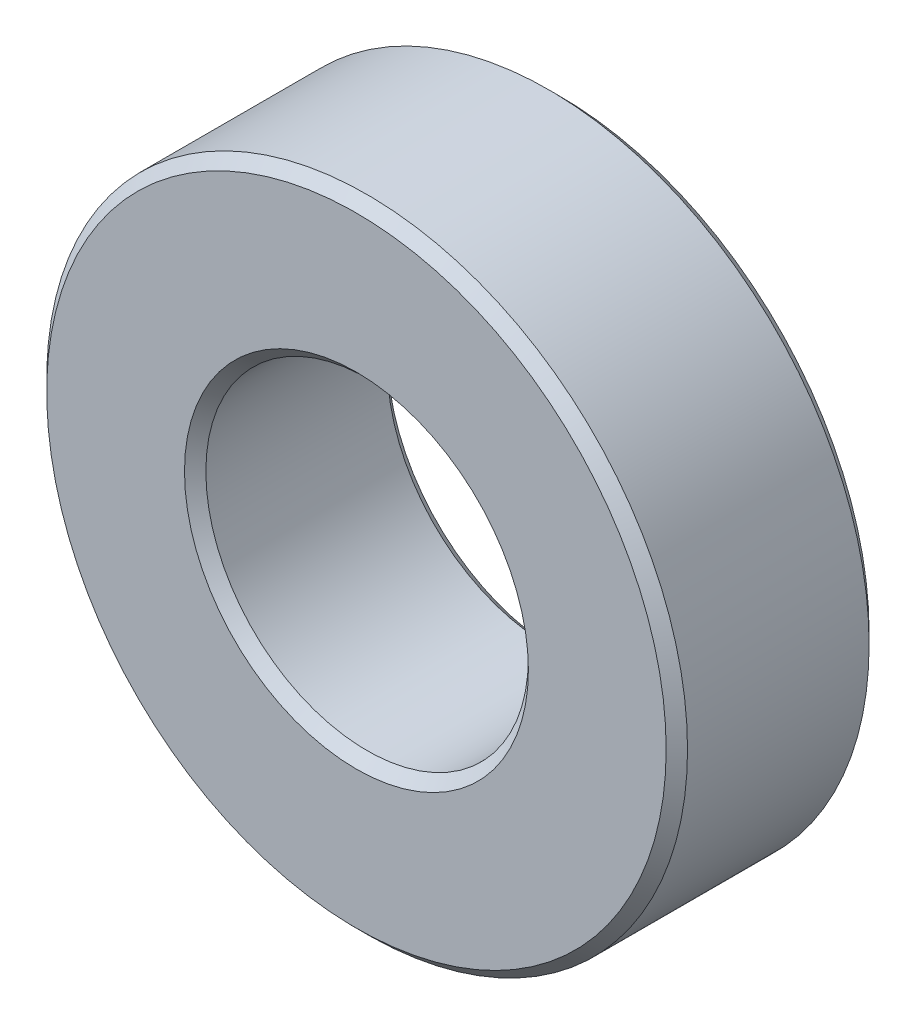
ISO-10303-21;
HEADER;
FILE_DESCRIPTION(('STEP AP214'),'2;1');
FILE_NAME('part.step','',(''),(''),'','','');
FILE_SCHEMA(('AUTOMOTIVE_DESIGN { 1 0 10303 214 1 1 1 1 }'));
ENDSEC;
DATA;
#1=APPLICATION_CONTEXT('core data for automotive mechanical design processes');
#2=APPLICATION_PROTOCOL_DEFINITION('international standard','automotive_design',2000,#1);
#3=PRODUCT_CONTEXT('',#1,'mechanical');
#4=PRODUCT('Part','Part','',(#3));
#5=PRODUCT_RELATED_PRODUCT_CATEGORY('part','',(#4));
#6=PRODUCT_DEFINITION_FORMATION('','',#4);
#7=PRODUCT_DEFINITION_CONTEXT('part definition',#1,'design');
#8=PRODUCT_DEFINITION('design','',#6,#7);
#9=PRODUCT_DEFINITION_SHAPE('','',#8);
#10=(LENGTH_UNIT() NAMED_UNIT(*) SI_UNIT(.MILLI.,.METRE.));
#11=(NAMED_UNIT(*) PLANE_ANGLE_UNIT() SI_UNIT($,.RADIAN.));
#12=(NAMED_UNIT(*) SI_UNIT($,.STERADIAN.) SOLID_ANGLE_UNIT());
#13=UNCERTAINTY_MEASURE_WITH_UNIT(LENGTH_MEASURE(1.E-05),#10,'distance_accuracy_value','');
#14=(GEOMETRIC_REPRESENTATION_CONTEXT(3) GLOBAL_UNCERTAINTY_ASSIGNED_CONTEXT((#13)) GLOBAL_UNIT_ASSIGNED_CONTEXT((#10,
#11,#12)) REPRESENTATION_CONTEXT('',''));
#15=CARTESIAN_POINT('',(0.,0.,0.));
#16=DIRECTION('',(0.,0.,1.));
#17=DIRECTION('',(1.,0.,0.));
#18=AXIS2_PLACEMENT_3D('',#15,#16,#17);
#19=CARTESIAN_POINT('',(0.,0.,19.));
#20=DIRECTION('',(0.,0.,1.));
#21=DIRECTION('',(1.,0.,0.));
#22=AXIS2_PLACEMENT_3D('',#19,#20,#21);
#23=PLANE('',#22);
#24=CARTESIAN_POINT('',(0.,0.,19.));
#25=DIRECTION('',(0.,0.,1.));
#26=DIRECTION('',(1.,0.,0.));
#27=AXIS2_PLACEMENT_3D('',#24,#25,#26);
#28=CIRCLE('',#27,16.1);
#29=CARTESIAN_POINT('',(16.1,0.,19.));
#30=VERTEX_POINT('',#29);
#31=EDGE_CURVE('E49',#30,#30,#28,.F.);
#32=ORIENTED_EDGE('',*,*,#31,.T.);
#33=EDGE_LOOP('',(#32));
#34=FACE_BOUND('',#33,.T.);
#35=CARTESIAN_POINT('',(0.,0.,19.));
#36=DIRECTION('',(0.,0.,1.));
#37=DIRECTION('',(1.,0.,0.));
#38=AXIS2_PLACEMENT_3D('',#35,#36,#37);
#39=CIRCLE('',#38,29.);
#40=CARTESIAN_POINT('',(29.,0.,19.));
#41=VERTEX_POINT('',#40);
#42=EDGE_CURVE('E53',#41,#41,#39,.T.);
#43=ORIENTED_EDGE('',*,*,#42,.T.);
#44=EDGE_LOOP('',(#43));
#45=FACE_BOUND('',#44,.T.);
#46=ADVANCED_FACE('F37',(#34,#45),#23,.T.);
#47=CARTESIAN_POINT('',(0.,0.,0.));
#48=DIRECTION('',(0.,0.,1.));
#49=DIRECTION('',(1.,0.,0.));
#50=AXIS2_PLACEMENT_3D('',#47,#48,#49);
#51=PLANE('',#50);
#52=CARTESIAN_POINT('',(0.,0.,0.));
#53=DIRECTION('',(0.,0.,1.));
#54=DIRECTION('',(1.,0.,0.));
#55=AXIS2_PLACEMENT_3D('',#52,#53,#54);
#56=CIRCLE('',#55,16.1);
#57=CARTESIAN_POINT('',(16.1,0.,0.));
#58=VERTEX_POINT('',#57);
#59=EDGE_CURVE('E64',#58,#58,#56,.T.);
#60=ORIENTED_EDGE('',*,*,#59,.T.);
#61=EDGE_LOOP('',(#60));
#62=FACE_BOUND('',#61,.T.);
#63=CARTESIAN_POINT('',(0.,0.,0.));
#64=DIRECTION('',(0.,0.,1.));
#65=DIRECTION('',(1.,0.,0.));
#66=AXIS2_PLACEMENT_3D('',#63,#64,#65);
#67=CIRCLE('',#66,29.);
#68=CARTESIAN_POINT('',(29.,0.,0.));
#69=VERTEX_POINT('',#68);
#70=EDGE_CURVE('E67',#69,#69,#67,.F.);
#71=ORIENTED_EDGE('',*,*,#70,.T.);
#72=EDGE_LOOP('',(#71));
#73=FACE_BOUND('',#72,.T.);
#74=ADVANCED_FACE('F71',(#62,#73),#51,.F.);
#75=CARTESIAN_POINT('',(0.,0.,19.));
#76=DIRECTION('',(0.,0.,-1.));
#77=DIRECTION('',(-1.,0.,0.));
#78=AXIS2_PLACEMENT_3D('',#75,#76,#77);
#79=CYLINDRICAL_SURFACE('',#78,30.);
#80=CARTESIAN_POINT('',(0.,0.,0.999999999999997));
#81=DIRECTION('',(0.,0.,1.));
#82=DIRECTION('',(1.,0.,0.));
#83=AXIS2_PLACEMENT_3D('',#80,#81,#82);
#84=CIRCLE('',#83,30.);
#85=CARTESIAN_POINT('',(30.,0.,0.999999999999997));
#86=VERTEX_POINT('',#85);
#87=EDGE_CURVE('E10',#86,#86,#84,.T.);
#88=ORIENTED_EDGE('',*,*,#87,.T.);
#89=EDGE_LOOP('',(#88));
#90=FACE_BOUND('',#89,.T.);
#91=CARTESIAN_POINT('',(0.,0.,18.));
#92=DIRECTION('',(0.,0.,1.));
#93=DIRECTION('',(1.,0.,0.));
#94=AXIS2_PLACEMENT_3D('',#91,#92,#93);
#95=CIRCLE('',#94,30.);
#96=CARTESIAN_POINT('',(30.,0.,18.));
#97=VERTEX_POINT('',#96);
#98=EDGE_CURVE('E45',#97,#97,#95,.F.);
#99=ORIENTED_EDGE('',*,*,#98,.T.);
#100=EDGE_LOOP('',(#99));
#101=FACE_BOUND('',#100,.T.);
#102=ADVANCED_FACE('F92',(#90,#101),#79,.T.);
#103=CARTESIAN_POINT('',(0.,0.,19.));
#104=DIRECTION('',(0.,0.,-1.));
#105=DIRECTION('',(-1.,0.,0.));
#106=AXIS2_PLACEMENT_3D('',#103,#104,#105);
#107=CYLINDRICAL_SURFACE('',#106,15.1);
#108=CARTESIAN_POINT('',(0.,0.,1.00000000000001));
#109=DIRECTION('',(0.,0.,1.));
#110=DIRECTION('',(1.,0.,0.));
#111=AXIS2_PLACEMENT_3D('',#108,#109,#110);
#112=CIRCLE('',#111,15.1);
#113=CARTESIAN_POINT('',(15.1,0.,1.00000000000001));
#114=VERTEX_POINT('',#113);
#115=EDGE_CURVE('E58',#114,#114,#112,.F.);
#116=ORIENTED_EDGE('',*,*,#115,.T.);
#117=EDGE_LOOP('',(#116));
#118=FACE_BOUND('',#117,.T.);
#119=CARTESIAN_POINT('',(0.,0.,18.));
#120=DIRECTION('',(0.,0.,1.));
#121=DIRECTION('',(1.,0.,0.));
#122=AXIS2_PLACEMENT_3D('',#119,#120,#121);
#123=CIRCLE('',#122,15.1);
#124=CARTESIAN_POINT('',(15.1,0.,18.));
#125=VERTEX_POINT('',#124);
#126=EDGE_CURVE('E61',#125,#125,#123,.T.);
#127=ORIENTED_EDGE('',*,*,#126,.T.);
#128=EDGE_LOOP('',(#127));
#129=FACE_BOUND('',#128,.T.);
#130=ADVANCED_FACE('F97',(#118,#129),#107,.F.);
#131=CARTESIAN_POINT('',(0.,0.,0.));
#132=DIRECTION('',(0.,0.,-1.));
#133=DIRECTION('',(-1.,0.,0.));
#134=AXIS2_PLACEMENT_3D('',#131,#132,#133);
#135=CONICAL_SURFACE('',#134,16.1,0.785398163397447);
#136=ORIENTED_EDGE('',*,*,#115,.F.);
#137=EDGE_LOOP('',(#136));
#138=FACE_BOUND('',#137,.T.);
#139=ORIENTED_EDGE('',*,*,#59,.F.);
#140=EDGE_LOOP('',(#139));
#141=FACE_BOUND('',#140,.T.);
#142=ADVANCED_FACE('F82',(#138,#141),#135,.F.);
#143=CARTESIAN_POINT('',(0.,0.,18.));
#144=DIRECTION('',(0.,0.,1.));
#145=DIRECTION('',(1.,0.,0.));
#146=AXIS2_PLACEMENT_3D('',#143,#144,#145);
#147=CONICAL_SURFACE('',#146,15.1,0.785398163397447);
#148=ORIENTED_EDGE('',*,*,#31,.F.);
#149=EDGE_LOOP('',(#148));
#150=FACE_BOUND('',#149,.T.);
#151=ORIENTED_EDGE('',*,*,#126,.F.);
#152=EDGE_LOOP('',(#151));
#153=FACE_BOUND('',#152,.T.);
#154=ADVANCED_FACE('F76',(#150,#153),#147,.F.);
#155=CARTESIAN_POINT('',(0.,0.,0.999999999999997));
#156=DIRECTION('',(0.,0.,1.));
#157=DIRECTION('',(1.,0.,0.));
#158=AXIS2_PLACEMENT_3D('',#155,#156,#157);
#159=CONICAL_SURFACE('',#158,30.,0.785398163397448);
#160=ORIENTED_EDGE('',*,*,#70,.F.);
#161=EDGE_LOOP('',(#160));
#162=FACE_BOUND('',#161,.T.);
#163=ORIENTED_EDGE('',*,*,#87,.F.);
#164=EDGE_LOOP('',(#163));
#165=FACE_BOUND('',#164,.T.);
#166=ADVANCED_FACE('F73',(#162,#165),#159,.T.);
#167=CARTESIAN_POINT('',(0.,0.,19.));
#168=DIRECTION('',(0.,0.,-1.));
#169=DIRECTION('',(-1.,0.,0.));
#170=AXIS2_PLACEMENT_3D('',#167,#168,#169);
#171=CONICAL_SURFACE('',#170,29.,0.78539816339745);
#172=ORIENTED_EDGE('',*,*,#98,.F.);
#173=EDGE_LOOP('',(#172));
#174=FACE_BOUND('',#173,.T.);
#175=ORIENTED_EDGE('',*,*,#42,.F.);
#176=EDGE_LOOP('',(#175));
#177=FACE_BOUND('',#176,.T.);
#178=ADVANCED_FACE('F40',(#174,#177),#171,.T.);
#179=CLOSED_SHELL('',(#46,#74,#102,#130,#142,#154,#166,#178));
#180=MANIFOLD_SOLID_BREP('B2',#179);
#181=ADVANCED_BREP_SHAPE_REPRESENTATION('',(#18,#180),#14);
#182=SHAPE_DEFINITION_REPRESENTATION(#9,#181);
ENDSEC;
END-ISO-10303-21;
